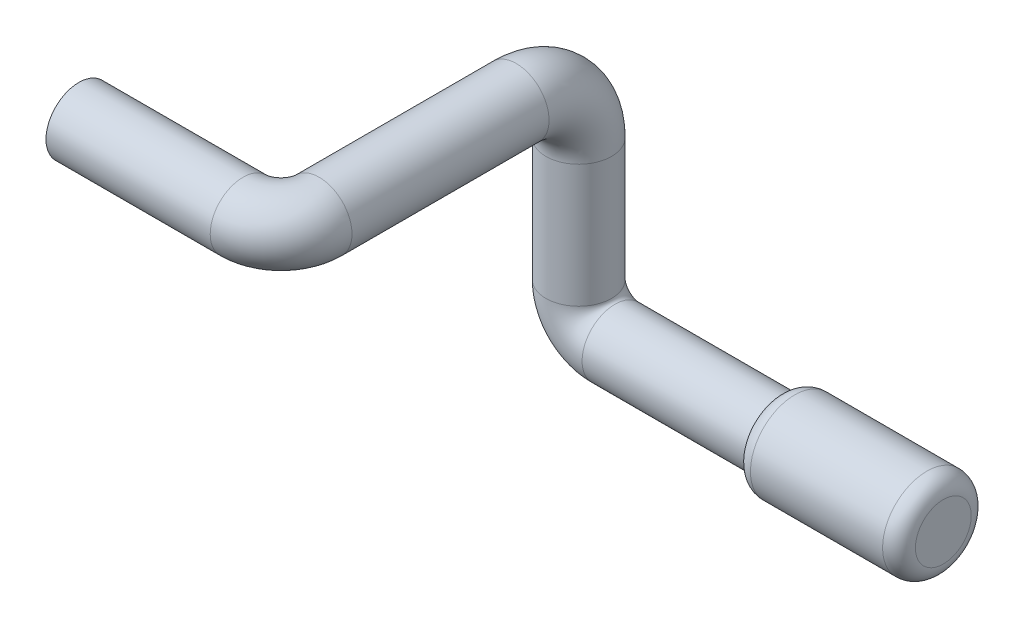
ISO-10303-21;
HEADER;
FILE_DESCRIPTION(('STEP AP214'),'2;1');
FILE_NAME('part.step','',(''),(''),'','','');
FILE_SCHEMA(('AUTOMOTIVE_DESIGN { 1 0 10303 214 1 1 1 1 }'));
ENDSEC;
DATA;
#1=APPLICATION_CONTEXT('core data for automotive mechanical design processes');
#2=APPLICATION_PROTOCOL_DEFINITION('international standard','automotive_design',2000,#1);
#3=PRODUCT_CONTEXT('',#1,'mechanical');
#4=PRODUCT('Part','Part','',(#3));
#5=PRODUCT_RELATED_PRODUCT_CATEGORY('part','',(#4));
#6=PRODUCT_DEFINITION_FORMATION('','',#4);
#7=PRODUCT_DEFINITION_CONTEXT('part definition',#1,'design');
#8=PRODUCT_DEFINITION('design','',#6,#7);
#9=PRODUCT_DEFINITION_SHAPE('','',#8);
#10=(LENGTH_UNIT() NAMED_UNIT(*) SI_UNIT(.MILLI.,.METRE.));
#11=(NAMED_UNIT(*) PLANE_ANGLE_UNIT() SI_UNIT($,.RADIAN.));
#12=(NAMED_UNIT(*) SI_UNIT($,.STERADIAN.) SOLID_ANGLE_UNIT());
#13=UNCERTAINTY_MEASURE_WITH_UNIT(LENGTH_MEASURE(1.E-05),#10,'distance_accuracy_value','');
#14=(GEOMETRIC_REPRESENTATION_CONTEXT(3) GLOBAL_UNCERTAINTY_ASSIGNED_CONTEXT((#13)) GLOBAL_UNIT_ASSIGNED_CONTEXT((#10,
#11,#12)) REPRESENTATION_CONTEXT('',''));
#15=CARTESIAN_POINT('',(0.,0.,0.));
#16=DIRECTION('',(0.,0.,1.));
#17=DIRECTION('',(1.,0.,0.));
#18=AXIS2_PLACEMENT_3D('',#15,#16,#17);
#19=CARTESIAN_POINT('',(36.8863089356673,-34.2911530645348,-46.0364034971308));
#20=DIRECTION('',(1.,0.,0.));
#21=DIRECTION('',(0.,0.,-1.));
#22=AXIS2_PLACEMENT_3D('',#19,#20,#21);
#23=CYLINDRICAL_SURFACE('',#22,5.08);
#24=CARTESIAN_POINT('',(36.8863089356673,-34.2911530645348,-46.0364034971308));
#25=DIRECTION('',(1.,0.,0.));
#26=DIRECTION('',(0.,-1.,0.));
#27=AXIS2_PLACEMENT_3D('',#24,#25,#26);
#28=CIRCLE('',#27,5.08);
#29=CARTESIAN_POINT('',(36.8863089356673,-39.3711530645348,-46.0364034971308));
#30=VERTEX_POINT('',#29);
#31=EDGE_CURVE('E55',#30,#30,#28,.T.);
#32=ORIENTED_EDGE('',*,*,#31,.T.);
#33=EDGE_LOOP('',(#32));
#34=FACE_BOUND('',#33,.T.);
#35=CARTESIAN_POINT('',(62.2863089356673,-34.2911530645348,-46.0364034971308));
#36=DIRECTION('',(1.,0.,0.));
#37=DIRECTION('',(0.,-1.,0.));
#38=AXIS2_PLACEMENT_3D('',#35,#36,#37);
#39=CIRCLE('',#38,5.08);
#40=CARTESIAN_POINT('',(62.2863089356673,-39.3711530645348,-46.0364034971308));
#41=VERTEX_POINT('',#40);
#42=EDGE_CURVE('E50',#41,#41,#39,.T.);
#43=ORIENTED_EDGE('',*,*,#42,.F.);
#44=EDGE_LOOP('',(#43));
#45=FACE_BOUND('',#44,.T.);
#46=ADVANCED_FACE('F35',(#34,#45),#23,.T.);
#47=CARTESIAN_POINT('',(36.8863089356673,-28.6921023106857,-46.0364034971308));
#48=DIRECTION('',(0.,0.,1.));
#49=DIRECTION('',(1.,0.,0.));
#50=AXIS2_PLACEMENT_3D('',#47,#48,#49);
#51=TOROIDAL_SURFACE('',#50,5.5990507538491,5.08);
#52=CARTESIAN_POINT('',(31.2872581818182,-28.6921023106856,-46.0364034971308));
#53=DIRECTION('',(0.,-1.,0.));
#54=DIRECTION('',(-1.,0.,0.));
#55=AXIS2_PLACEMENT_3D('',#52,#53,#54);
#56=CIRCLE('',#55,5.08);
#57=CARTESIAN_POINT('',(26.2072581818182,-28.6921023106856,-46.0364034971308));
#58=VERTEX_POINT('',#57);
#59=EDGE_CURVE('E58',#58,#58,#56,.T.);
#60=CARTESIAN_POINT('',(36.8863089356673,-28.6921023106857,-46.0364034971308));
#61=DIRECTION('',(0.,0.,1.));
#62=DIRECTION('',(1.,0.,0.));
#63=AXIS2_PLACEMENT_3D('',#60,#61,#62);
#64=CIRCLE('',#63,10.6790507538491);
#65=EDGE_CURVE('',#58,#30,#64,.T.);
#66=ORIENTED_EDGE('',*,*,#59,.T.);
#67=ORIENTED_EDGE('',*,*,#31,.F.);
#68=ORIENTED_EDGE('',*,*,#65,.T.);
#69=ORIENTED_EDGE('',*,*,#65,.F.);
#70=EDGE_LOOP('',(#66,#68,#67,#69));
#71=FACE_BOUND('',#70,.T.);
#72=ADVANCED_FACE('F96',(#71),#51,.T.);
#73=CARTESIAN_POINT('',(31.2872581818182,-9.66914531531259,-46.0364034971308));
#74=DIRECTION('',(0.,-1.,0.));
#75=DIRECTION('',(0.,0.,-1.));
#76=AXIS2_PLACEMENT_3D('',#73,#74,#75);
#77=CYLINDRICAL_SURFACE('',#76,5.08);
#78=CARTESIAN_POINT('',(31.2872581818182,-9.66914531531259,-46.0364034971308));
#79=DIRECTION('',(0.,-1.,0.));
#80=DIRECTION('',(-1.,0.,0.));
#81=AXIS2_PLACEMENT_3D('',#78,#79,#80);
#82=CIRCLE('',#81,5.08);
#83=CARTESIAN_POINT('',(31.2872581818182,-9.66914531531259,-51.1164034971308));
#84=VERTEX_POINT('',#83);
#85=EDGE_CURVE('E61',#84,#84,#82,.T.);
#86=ORIENTED_EDGE('',*,*,#85,.T.);
#87=EDGE_LOOP('',(#86));
#88=FACE_BOUND('',#87,.T.);
#89=ORIENTED_EDGE('',*,*,#59,.F.);
#90=EDGE_LOOP('',(#89));
#91=FACE_BOUND('',#90,.T.);
#92=ADVANCED_FACE('F102',(#88,#91),#77,.T.);
#93=CARTESIAN_POINT('',(31.2872581818182,-9.6691453153126,-36.3672581818182));
#94=DIRECTION('',(-1.,0.,0.));
#95=DIRECTION('',(0.,0.,1.));
#96=AXIS2_PLACEMENT_3D('',#93,#94,#95);
#97=TOROIDAL_SURFACE('',#96,9.6691453153126,5.08);
#98=CARTESIAN_POINT('',(31.2872581818182,0.,-36.3672581818182));
#99=DIRECTION('',(0.,0.,-1.));
#100=DIRECTION('',(-1.,0.,0.));
#101=AXIS2_PLACEMENT_3D('',#98,#99,#100);
#102=CIRCLE('',#101,5.08);
#103=CARTESIAN_POINT('',(31.2872581818182,5.08,-36.3672581818182));
#104=VERTEX_POINT('',#103);
#105=EDGE_CURVE('E64',#104,#104,#102,.T.);
#106=CARTESIAN_POINT('',(31.2872581818182,-9.6691453153126,-36.3672581818182));
#107=DIRECTION('',(-1.,0.,0.));
#108=DIRECTION('',(0.,0.,1.));
#109=AXIS2_PLACEMENT_3D('',#106,#107,#108);
#110=CIRCLE('',#109,14.7491453153126);
#111=EDGE_CURVE('',#104,#84,#110,.T.);
#112=ORIENTED_EDGE('',*,*,#105,.T.);
#113=ORIENTED_EDGE('',*,*,#85,.F.);
#114=ORIENTED_EDGE('',*,*,#111,.T.);
#115=ORIENTED_EDGE('',*,*,#111,.F.);
#116=EDGE_LOOP('',(#112,#114,#113,#115));
#117=FACE_BOUND('',#116,.T.);
#118=ADVANCED_FACE('F153',(#117),#97,.T.);
#119=CARTESIAN_POINT('',(31.2872581818182,0.,-5.88725818181818));
#120=DIRECTION('',(0.,0.,-1.));
#121=DIRECTION('',(-1.,0.,0.));
#122=AXIS2_PLACEMENT_3D('',#119,#120,#121);
#123=CYLINDRICAL_SURFACE('',#122,5.08);
#124=CARTESIAN_POINT('',(31.2872581818182,0.,-5.88725818181818));
#125=DIRECTION('',(0.,0.,-1.));
#126=DIRECTION('',(-1.,0.,0.));
#127=AXIS2_PLACEMENT_3D('',#124,#125,#126);
#128=CIRCLE('',#127,5.08);
#129=CARTESIAN_POINT('',(36.3672581818182,0.,-5.88725818181819));
#130=VERTEX_POINT('',#129);
#131=EDGE_CURVE('E67',#130,#130,#128,.T.);
#132=ORIENTED_EDGE('',*,*,#131,.T.);
#133=EDGE_LOOP('',(#132));
#134=FACE_BOUND('',#133,.T.);
#135=ORIENTED_EDGE('',*,*,#105,.F.);
#136=EDGE_LOOP('',(#135));
#137=FACE_BOUND('',#136,.T.);
#138=ADVANCED_FACE('F144',(#134,#137),#123,.T.);
#139=CARTESIAN_POINT('',(25.4,0.,-5.88725818181818));
#140=DIRECTION('',(0.,1.,0.));
#141=DIRECTION('',(0.,0.,1.));
#142=AXIS2_PLACEMENT_3D('',#139,#140,#141);
#143=TOROIDAL_SURFACE('',#142,5.88725818181818,5.08);
#144=CARTESIAN_POINT('',(25.4,0.,0.));
#145=DIRECTION('',(1.,0.,0.));
#146=DIRECTION('',(0.,0.,-1.));
#147=AXIS2_PLACEMENT_3D('',#144,#145,#146);
#148=CIRCLE('',#147,5.08);
#149=CARTESIAN_POINT('',(25.4,0.,5.08));
#150=VERTEX_POINT('',#149);
#151=EDGE_CURVE('E70',#150,#150,#148,.T.);
#152=CARTESIAN_POINT('',(25.4,0.,-5.88725818181818));
#153=DIRECTION('',(0.,1.,0.));
#154=DIRECTION('',(0.,0.,1.));
#155=AXIS2_PLACEMENT_3D('',#152,#153,#154);
#156=CIRCLE('',#155,10.9672581818182);
#157=EDGE_CURVE('',#150,#130,#156,.T.);
#158=ORIENTED_EDGE('',*,*,#151,.T.);
#159=ORIENTED_EDGE('',*,*,#131,.F.);
#160=ORIENTED_EDGE('',*,*,#157,.T.);
#161=ORIENTED_EDGE('',*,*,#157,.F.);
#162=EDGE_LOOP('',(#158,#160,#159,#161));
#163=FACE_BOUND('',#162,.T.);
#164=ADVANCED_FACE('F77',(#163),#143,.T.);
#165=CARTESIAN_POINT('',(25.4,0.,0.));
#166=DIRECTION('',(-1.,0.,0.));
#167=DIRECTION('',(0.,0.,1.));
#168=AXIS2_PLACEMENT_3D('',#165,#166,#167);
#169=CYLINDRICAL_SURFACE('',#168,5.08);
#170=ORIENTED_EDGE('',*,*,#151,.F.);
#171=EDGE_LOOP('',(#170));
#172=FACE_BOUND('',#171,.T.);
#173=CARTESIAN_POINT('',(0.,0.,0.));
#174=DIRECTION('',(1.,0.,0.));
#175=DIRECTION('',(0.,0.,-1.));
#176=AXIS2_PLACEMENT_3D('',#173,#174,#175);
#177=CIRCLE('',#176,5.08);
#178=CARTESIAN_POINT('',(0.,0.,-5.08));
#179=VERTEX_POINT('',#178);
#180=EDGE_CURVE('E71',#179,#179,#177,.T.);
#181=ORIENTED_EDGE('',*,*,#180,.T.);
#182=EDGE_LOOP('',(#181));
#183=FACE_BOUND('',#182,.T.);
#184=ADVANCED_FACE('F80',(#172,#183),#169,.T.);
#185=CARTESIAN_POINT('',(0.,0.,0.));
#186=DIRECTION('',(1.,0.,0.));
#187=DIRECTION('',(0.,0.,-1.));
#188=AXIS2_PLACEMENT_3D('',#185,#186,#187);
#189=PLANE('',#188);
#190=ORIENTED_EDGE('',*,*,#180,.F.);
#191=EDGE_LOOP('',(#190));
#192=FACE_BOUND('',#191,.T.);
#193=ADVANCED_FACE('F83',(#192),#189,.F.);
#194=CARTESIAN_POINT('',(87.6863089356673,-34.2911530645348,-46.0364034971308));
#195=DIRECTION('',(-1.,0.,0.));
#196=DIRECTION('',(0.,-1.,0.));
#197=AXIS2_PLACEMENT_3D('',#194,#195,#196);
#198=CYLINDRICAL_SURFACE('',#197,6.858);
#199=CARTESIAN_POINT('',(85.1463089356673,-34.2911530645348,-46.0364034971308));
#200=DIRECTION('',(1.,0.,0.));
#201=DIRECTION('',(0.,1.,0.));
#202=AXIS2_PLACEMENT_3D('',#199,#200,#201);
#203=CIRCLE('',#202,6.858);
#204=CARTESIAN_POINT('',(85.1463089356672,-41.1491530645348,-46.0364034971308));
#205=VERTEX_POINT('',#204);
#206=EDGE_CURVE('E10',#205,#205,#203,.F.);
#207=CARTESIAN_POINT('',(64.7093145072663,-34.2911530645348,-46.0364034971308));
#208=DIRECTION('',(-1.,0.,0.));
#209=DIRECTION('',(0.,-1.,0.));
#210=AXIS2_PLACEMENT_3D('',#207,#208,#209);
#211=CIRCLE('',#210,6.858);
#212=CARTESIAN_POINT('',(64.7093145072663,-41.1491530645348,-46.0364034971308));
#213=VERTEX_POINT('',#212);
#214=EDGE_CURVE('E42',#213,#213,#211,.F.);
#215=CARTESIAN_POINT('',(85.1463089356672,-41.1491530645348,-46.0364034971308));
#216=CARTESIAN_POINT('',(84.9334235770381,-41.1491530645348,-46.0364034971308));
#217=CARTESIAN_POINT('',(84.7205382184089,-41.1491530645348,-46.0364034971308));
#218=CARTESIAN_POINT('',(84.2947675011506,-41.1491530645348,-46.0364034971308));
#219=CARTESIAN_POINT('',(84.0818821425214,-41.1491530645348,-46.0364034971308));
#220=CARTESIAN_POINT('',(83.656111425263,-41.1491530645348,-46.0364034971308));
#221=CARTESIAN_POINT('',(83.4432260666338,-41.1491530645348,-46.0364034971308));
#222=CARTESIAN_POINT('',(83.0174553493755,-41.1491530645348,-46.0364034971308));
#223=CARTESIAN_POINT('',(82.8045699907463,-41.1491530645348,-46.0364034971308));
#224=CARTESIAN_POINT('',(82.378799273488,-41.1491530645348,-46.0364034971308));
#225=CARTESIAN_POINT('',(82.1659139148588,-41.1491530645348,-46.0364034971308));
#226=CARTESIAN_POINT('',(81.7401431976004,-41.1491530645348,-46.0364034971308));
#227=CARTESIAN_POINT('',(81.5272578389713,-41.1491530645348,-46.0364034971308));
#228=CARTESIAN_POINT('',(81.1014871217129,-41.1491530645348,-46.0364034971308));
#229=CARTESIAN_POINT('',(80.8886017630837,-41.1491530645348,-46.0364034971308));
#230=CARTESIAN_POINT('',(80.4628310458254,-41.1491530645348,-46.0364034971308));
#231=CARTESIAN_POINT('',(80.2499456871962,-41.1491530645348,-46.0364034971308));
#232=CARTESIAN_POINT('',(79.8241749699378,-41.1491530645348,-46.0364034971308));
#233=CARTESIAN_POINT('',(79.6112896113087,-41.1491530645348,-46.0364034971308));
#234=CARTESIAN_POINT('',(79.1855188940503,-41.1491530645348,-46.0364034971308));
#235=CARTESIAN_POINT('',(78.9726335354211,-41.1491530645348,-46.0364034971308));
#236=CARTESIAN_POINT('',(78.5468628181628,-41.1491530645348,-46.0364034971308));
#237=CARTESIAN_POINT('',(78.3339774595336,-41.1491530645348,-46.0364034971308));
#238=CARTESIAN_POINT('',(77.9082067422753,-41.1491530645348,-46.0364034971308));
#239=CARTESIAN_POINT('',(77.6953213836461,-41.1491530645348,-46.0364034971308));
#240=CARTESIAN_POINT('',(77.2695506663877,-41.1491530645348,-46.0364034971308));
#241=CARTESIAN_POINT('',(77.0566653077585,-41.1491530645348,-46.0364034971308));
#242=CARTESIAN_POINT('',(76.6308945905002,-41.1491530645348,-46.0364034971308));
#243=CARTESIAN_POINT('',(76.418009231871,-41.1491530645348,-46.0364034971308));
#244=CARTESIAN_POINT('',(75.9922385146127,-41.1491530645348,-46.0364034971308));
#245=CARTESIAN_POINT('',(75.7793531559835,-41.1491530645348,-46.0364034971308));
#246=CARTESIAN_POINT('',(75.3535824387251,-41.1491530645348,-46.0364034971308));
#247=CARTESIAN_POINT('',(75.1406970800959,-41.1491530645348,-46.0364034971308));
#248=CARTESIAN_POINT('',(74.7149263628376,-41.1491530645348,-46.0364034971308));
#249=CARTESIAN_POINT('',(74.5020410042084,-41.1491530645348,-46.0364034971308));
#250=CARTESIAN_POINT('',(74.0762702869501,-41.1491530645348,-46.0364034971308));
#251=CARTESIAN_POINT('',(73.8633849283209,-41.1491530645348,-46.0364034971308));
#252=CARTESIAN_POINT('',(73.4376142110625,-41.1491530645348,-46.0364034971308));
#253=CARTESIAN_POINT('',(73.2247288524334,-41.1491530645348,-46.0364034971308));
#254=CARTESIAN_POINT('',(72.798958135175,-41.1491530645348,-46.0364034971308));
#255=CARTESIAN_POINT('',(72.5860727765458,-41.1491530645348,-46.0364034971308));
#256=CARTESIAN_POINT('',(72.1603020592875,-41.1491530645348,-46.0364034971308));
#257=CARTESIAN_POINT('',(71.9474167006583,-41.1491530645348,-46.0364034971308));
#258=CARTESIAN_POINT('',(71.5216459833999,-41.1491530645348,-46.0364034971308));
#259=CARTESIAN_POINT('',(71.3087606247708,-41.1491530645348,-46.0364034971308));
#260=CARTESIAN_POINT('',(70.8829899075124,-41.1491530645348,-46.0364034971308));
#261=CARTESIAN_POINT('',(70.6701045488832,-41.1491530645348,-46.0364034971308));
#262=CARTESIAN_POINT('',(70.2443338316249,-41.1491530645348,-46.0364034971308));
#263=CARTESIAN_POINT('',(70.0314484729957,-41.1491530645348,-46.0364034971308));
#264=CARTESIAN_POINT('',(69.6056777557373,-41.1491530645348,-46.0364034971308));
#265=CARTESIAN_POINT('',(69.3927923971082,-41.1491530645348,-46.0364034971308));
#266=CARTESIAN_POINT('',(68.9670216798498,-41.1491530645348,-46.0364034971308));
#267=CARTESIAN_POINT('',(68.7541363212207,-41.1491530645348,-46.0364034971308));
#268=CARTESIAN_POINT('',(68.3283656039623,-41.1491530645348,-46.0364034971308));
#269=CARTESIAN_POINT('',(68.1154802453331,-41.1491530645348,-46.0364034971308));
#270=CARTESIAN_POINT('',(67.6897095280748,-41.1491530645348,-46.0364034971308));
#271=CARTESIAN_POINT('',(67.4768241694456,-41.1491530645348,-46.0364034971308));
#272=CARTESIAN_POINT('',(67.0510534521872,-41.1491530645348,-46.0364034971308));
#273=CARTESIAN_POINT('',(66.8381680935581,-41.1491530645348,-46.0364034971308));
#274=CARTESIAN_POINT('',(66.4123973762997,-41.1491530645348,-46.0364034971308));
#275=CARTESIAN_POINT('',(66.1995120176705,-41.1491530645348,-46.0364034971308));
#276=CARTESIAN_POINT('',(65.7737413004122,-41.1491530645348,-46.0364034971308));
#277=CARTESIAN_POINT('',(65.560855941783,-41.1491530645348,-46.0364034971308));
#278=CARTESIAN_POINT('',(65.1350852245246,-41.1491530645348,-46.0364034971308));
#279=CARTESIAN_POINT('',(64.9221998658955,-41.1491530645348,-46.0364034971308));
#280=CARTESIAN_POINT('',(64.7093145072663,-41.1491530645348,-46.0364034971308));
#281=B_SPLINE_CURVE_WITH_KNOTS('',3,(#215,#216,#217,#218,#219,#220,#221,#222,#223,#224,#225,
#226,#227,#228,#229,#230,#231,#232,#233,#234,#235,#236,#237,#238,#239,#240,#241,#242,#243,#244,
#245,#246,#247,#248,#249,#250,#251,#252,#253,#254,#255,#256,#257,#258,#259,#260,#261,#262,#263,
#264,#265,#266,#267,#268,#269,#270,#271,#272,#273,#274,#275,#276,#277,#278,#279,#280),
.UNSPECIFIED.,.F.,.F.,(4,2,2,2,2,2,2,2,2,2,2,2,2,2,2,2,2,2,2,2,2,2,2,2,2,2,2,2,2,2,2,2,4),(0.,
0.63865607588752,1.27731215177505,1.91596822766259,2.55462430355012,3.19328037943764,
3.83193645532517,4.47059253121271,5.10924860710024,5.74790468298776,6.3865607588753,
7.02521683476283,7.66387291065036,8.30252898653788,8.94118506242542,9.57984113831295,
10.2184972142005,10.857153290088,11.4958093659755,12.1344654418631,12.7731215177506,
13.4117775936381,14.0504336695257,14.6890897454132,15.3277458213007,15.9664018971882,
16.6050579730758,17.2437140489633,17.8823701248508,18.5210262007384,19.1596822766259,
19.7983383525134,20.436994428401),.UNSPECIFIED.);
#282=EDGE_CURVE('BSEAM88',#205,#213,#281,.T.);
#283=ORIENTED_EDGE('',*,*,#206,.T.);
#284=ORIENTED_EDGE('',*,*,#214,.T.);
#285=ORIENTED_EDGE('',*,*,#282,.T.);
#286=ORIENTED_EDGE('',*,*,#282,.F.);
#287=EDGE_LOOP('',(#283,#285,#284,#286));
#288=FACE_BOUND('',#287,.T.);
#289=ADVANCED_FACE('F88',(#288),#198,.T.);
#290=CARTESIAN_POINT('',(87.6863089356673,-34.2911530645348,-46.0364034971308));
#291=DIRECTION('',(1.,0.,0.));
#292=DIRECTION('',(0.,1.,0.));
#293=AXIS2_PLACEMENT_3D('',#290,#291,#292);
#294=PLANE('',#293);
#295=CARTESIAN_POINT('',(87.6863089356673,-34.2911530645348,-46.0364034971308));
#296=DIRECTION('',(1.,0.,0.));
#297=DIRECTION('',(0.,1.,0.));
#298=AXIS2_PLACEMENT_3D('',#295,#296,#297);
#299=CIRCLE('',#298,4.318);
#300=CARTESIAN_POINT('',(87.6863089356673,-29.9731530645348,-46.0364034971308));
#301=VERTEX_POINT('',#300);
#302=EDGE_CURVE('E46',#301,#301,#299,.T.);
#303=ORIENTED_EDGE('',*,*,#302,.T.);
#304=EDGE_LOOP('',(#303));
#305=FACE_BOUND('',#304,.T.);
#306=ADVANCED_FACE('F93',(#305),#294,.T.);
#307=CARTESIAN_POINT('',(85.1463089356673,-34.2911530645348,-46.0364034971308));
#308=DIRECTION('',(1.,0.,0.));
#309=DIRECTION('',(0.,1.,0.));
#310=AXIS2_PLACEMENT_3D('',#307,#308,#309);
#311=TOROIDAL_SURFACE('',#310,4.318,2.54);
#312=ORIENTED_EDGE('',*,*,#206,.F.);
#313=EDGE_LOOP('',(#312));
#314=FACE_BOUND('',#313,.T.);
#315=ORIENTED_EDGE('',*,*,#302,.F.);
#316=EDGE_LOOP('',(#315));
#317=FACE_BOUND('',#316,.T.);
#318=ADVANCED_FACE('F107',(#314,#317),#311,.T.);
#319=CARTESIAN_POINT('',(64.7093145072663,-34.2911530645348,-46.0364034971308));
#320=DIRECTION('',(-1.,0.,0.));
#321=DIRECTION('',(0.,-1.,0.));
#322=AXIS2_PLACEMENT_3D('',#319,#320,#321);
#323=TOROIDAL_SURFACE('',#322,4.318,2.54);
#324=ORIENTED_EDGE('',*,*,#42,.T.);
#325=EDGE_LOOP('',(#324));
#326=FACE_BOUND('',#325,.T.);
#327=ORIENTED_EDGE('',*,*,#214,.F.);
#328=EDGE_LOOP('',(#327));
#329=FACE_BOUND('',#328,.T.);
#330=ADVANCED_FACE('F37',(#326,#329),#323,.T.);
#331=CLOSED_SHELL('',(#46,#72,#92,#118,#138,#164,#184,#193,#289,#306,#318,#330));
#332=MANIFOLD_SOLID_BREP('B2',#331);
#333=ADVANCED_BREP_SHAPE_REPRESENTATION('',(#18,#332),#14);
#334=SHAPE_DEFINITION_REPRESENTATION(#9,#333);
ENDSEC;
END-ISO-10303-21;
